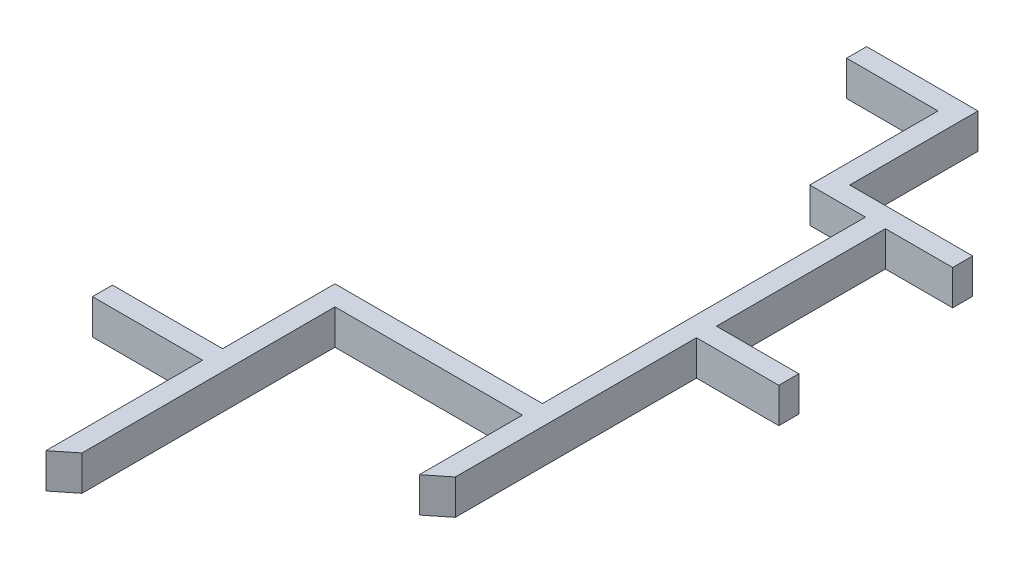
ISO-10303-21;
HEADER;
FILE_DESCRIPTION(('STEP AP214'),'2;1');
FILE_NAME('part.step','',(''),(''),'','','');
FILE_SCHEMA(('AUTOMOTIVE_DESIGN { 1 0 10303 214 1 1 1 1 }'));
ENDSEC;
DATA;
#1=APPLICATION_CONTEXT('core data for automotive mechanical design processes');
#2=APPLICATION_PROTOCOL_DEFINITION('international standard','automotive_design',2000,#1);
#3=PRODUCT_CONTEXT('',#1,'mechanical');
#4=PRODUCT('Part','Part','',(#3));
#5=PRODUCT_RELATED_PRODUCT_CATEGORY('part','',(#4));
#6=PRODUCT_DEFINITION_FORMATION('','',#4);
#7=PRODUCT_DEFINITION_CONTEXT('part definition',#1,'design');
#8=PRODUCT_DEFINITION('design','',#6,#7);
#9=PRODUCT_DEFINITION_SHAPE('','',#8);
#10=(LENGTH_UNIT() NAMED_UNIT(*) SI_UNIT(.MILLI.,.METRE.));
#11=(NAMED_UNIT(*) PLANE_ANGLE_UNIT() SI_UNIT($,.RADIAN.));
#12=(NAMED_UNIT(*) SI_UNIT($,.STERADIAN.) SOLID_ANGLE_UNIT());
#13=UNCERTAINTY_MEASURE_WITH_UNIT(LENGTH_MEASURE(1.E-05),#10,'distance_accuracy_value','');
#14=(GEOMETRIC_REPRESENTATION_CONTEXT(3) GLOBAL_UNCERTAINTY_ASSIGNED_CONTEXT((#13)) GLOBAL_UNIT_ASSIGNED_CONTEXT((#10,
#11,#12)) REPRESENTATION_CONTEXT('',''));
#15=CARTESIAN_POINT('',(0.,0.,0.));
#16=DIRECTION('',(0.,0.,1.));
#17=DIRECTION('',(1.,0.,0.));
#18=AXIS2_PLACEMENT_3D('',#15,#16,#17);
#19=CARTESIAN_POINT('',(40.0618679744798,-0.01,46.4845918549604));
#20=DIRECTION('',(0.624426731607843,0.,0.781083386619858));
#21=DIRECTION('',(0.781083386619858,0.,-0.624426731607843));
#22=AXIS2_PLACEMENT_3D('',#19,#20,#21);
#23=PLANE('',#22);
#24=DIRECTION('',(0.781083386619858,0.,-0.624426731607843));
#25=VECTOR('',#24,1.);
#26=CARTESIAN_POINT('',(38.2923721847623,0.,47.8991917446709));
#27=LINE('',#26,#25);
#28=CARTESIAN_POINT('',(47.3251652677286,0.,40.6780453745054));
#29=VERTEX_POINT('',#28);
#30=CARTESIAN_POINT('',(51.3251652677286,0.,37.48029854079));
#31=VERTEX_POINT('',#30);
#32=EDGE_CURVE('E349',#29,#31,#27,.T.);
#33=ORIENTED_EDGE('',*,*,#32,.T.);
#34=DIRECTION('',(0.,1.,0.));
#35=VECTOR('',#34,1.);
#36=CARTESIAN_POINT('',(51.3251652677286,7.,37.48029854079));
#37=LINE('',#36,#35);
#38=CARTESIAN_POINT('',(51.3251652677286,7.,37.48029854079));
#39=VERTEX_POINT('',#38);
#40=EDGE_CURVE('E346',#31,#39,#37,.T.);
#41=ORIENTED_EDGE('',*,*,#40,.T.);
#42=DIRECTION('',(0.781083386619858,0.,-0.624426731607843));
#43=VECTOR('',#42,1.);
#44=CARTESIAN_POINT('',(38.2923721847623,7.,47.8991917446709));
#45=LINE('',#44,#43);
#46=CARTESIAN_POINT('',(47.3251652677286,7.,40.6780453745054));
#47=VERTEX_POINT('',#46);
#48=EDGE_CURVE('E338',#47,#39,#45,.T.);
#49=ORIENTED_EDGE('',*,*,#48,.F.);
#50=DIRECTION('',(0.,1.,0.));
#51=VECTOR('',#50,1.);
#52=CARTESIAN_POINT('',(47.3251652677286,7.,40.6780453745054));
#53=LINE('',#52,#51);
#54=EDGE_CURVE('E216',#29,#47,#53,.T.);
#55=ORIENTED_EDGE('',*,*,#54,.F.);
#56=EDGE_LOOP('',(#33,#41,#49,#55));
#57=FACE_BOUND('',#56,.T.);
#58=ADVANCED_FACE('F42',(#57),#23,.T.);
#59=CARTESIAN_POINT('',(88.8387773673658,7.,7.49053996257907));
#60=VERTEX_POINT('',#59);
#61=CARTESIAN_POINT('',(92.8387773673658,7.,4.29279312886364));
#62=VERTEX_POINT('',#61);
#63=EDGE_CURVE('E335',#60,#62,#45,.T.);
#64=ORIENTED_EDGE('',*,*,#63,.F.);
#65=DIRECTION('',(0.,-1.,0.));
#66=VECTOR('',#65,1.);
#67=CARTESIAN_POINT('',(88.8387773673658,7.,7.49053996257909));
#68=LINE('',#67,#66);
#69=CARTESIAN_POINT('',(88.8387773673658,0.,7.49053996257907));
#70=VERTEX_POINT('',#69);
#71=EDGE_CURVE('E343',#60,#70,#68,.T.);
#72=ORIENTED_EDGE('',*,*,#71,.T.);
#73=CARTESIAN_POINT('',(92.8387773673658,0.,4.29279312886364));
#74=VERTEX_POINT('',#73);
#75=EDGE_CURVE('E350',#70,#74,#27,.T.);
#76=ORIENTED_EDGE('',*,*,#75,.T.);
#77=DIRECTION('',(0.,-1.,0.));
#78=VECTOR('',#77,1.);
#79=CARTESIAN_POINT('',(92.8387773673658,7.,4.29279312886366));
#80=LINE('',#79,#78);
#81=EDGE_CURVE('E340',#62,#74,#80,.T.);
#82=ORIENTED_EDGE('',*,*,#81,.F.);
#83=EDGE_LOOP('',(#64,#72,#76,#82));
#84=FACE_BOUND('',#83,.T.);
#85=ADVANCED_FACE('F377',(#84),#23,.T.);
#86=CARTESIAN_POINT('',(88.8387773673658,7.,0.));
#87=DIRECTION('',(1.,0.,0.));
#88=DIRECTION('',(0.,0.,-1.));
#89=AXIS2_PLACEMENT_3D('',#86,#87,#88);
#90=PLANE('',#89);
#91=ORIENTED_EDGE('',*,*,#71,.F.);
#92=DIRECTION('',(0.,0.,1.));
#93=VECTOR('',#92,1.);
#94=CARTESIAN_POINT('',(88.8387773673658,7.,0.));
#95=LINE('',#94,#93);
#96=CARTESIAN_POINT('',(88.8387773673658,7.,-13.1378549992244));
#97=VERTEX_POINT('',#96);
#98=EDGE_CURVE('E219',#97,#60,#95,.T.);
#99=ORIENTED_EDGE('',*,*,#98,.F.);
#100=DIRECTION('',(0.,-1.,0.));
#101=VECTOR('',#100,1.);
#102=CARTESIAN_POINT('',(88.8387773673658,7.,-13.1378549992244));
#103=LINE('',#102,#101);
#104=CARTESIAN_POINT('',(88.8387773673658,0.,-13.1378549992244));
#105=VERTEX_POINT('',#104);
#106=EDGE_CURVE('E52',#97,#105,#103,.T.);
#107=ORIENTED_EDGE('',*,*,#106,.T.);
#108=DIRECTION('',(0.,0.,1.));
#109=VECTOR('',#108,1.);
#110=CARTESIAN_POINT('',(88.8387773673658,0.,0.));
#111=LINE('',#110,#109);
#112=EDGE_CURVE('E356',#105,#70,#111,.T.);
#113=ORIENTED_EDGE('',*,*,#112,.T.);
#114=EDGE_LOOP('',(#91,#99,#107,#113));
#115=FACE_BOUND('',#114,.T.);
#116=ADVANCED_FACE('F371',(#115),#90,.F.);
#117=CARTESIAN_POINT('',(51.3251652677286,7.,0.));
#118=DIRECTION('',(-1.,0.,0.));
#119=DIRECTION('',(0.,0.,1.));
#120=AXIS2_PLACEMENT_3D('',#117,#118,#119);
#121=PLANE('',#120);
#122=ORIENTED_EDGE('',*,*,#40,.F.);
#123=DIRECTION('',(0.,0.,-1.));
#124=VECTOR('',#123,1.);
#125=CARTESIAN_POINT('',(51.3251652677286,0.,0.));
#126=LINE('',#125,#124);
#127=CARTESIAN_POINT('',(51.3251652677286,0.,-13.1378549992244));
#128=VERTEX_POINT('',#127);
#129=EDGE_CURVE('E133',#31,#128,#126,.T.);
#130=ORIENTED_EDGE('',*,*,#129,.T.);
#131=DIRECTION('',(0.,-1.,0.));
#132=VECTOR('',#131,1.);
#133=CARTESIAN_POINT('',(51.3251652677286,7.,-13.1378549992244));
#134=LINE('',#133,#132);
#135=CARTESIAN_POINT('',(51.3251652677286,7.,-13.1378549992244));
#136=VERTEX_POINT('',#135);
#137=EDGE_CURVE('E11',#136,#128,#134,.T.);
#138=ORIENTED_EDGE('',*,*,#137,.F.);
#139=DIRECTION('',(0.,0.,-1.));
#140=VECTOR('',#139,1.);
#141=CARTESIAN_POINT('',(51.3251652677286,7.,0.));
#142=LINE('',#141,#140);
#143=EDGE_CURVE('E46',#39,#136,#142,.T.);
#144=ORIENTED_EDGE('',*,*,#143,.F.);
#145=EDGE_LOOP('',(#122,#130,#138,#144));
#146=FACE_BOUND('',#145,.T.);
#147=ADVANCED_FACE('F366',(#146),#121,.F.);
#148=CARTESIAN_POINT('',(92.8387773673658,7.,0.));
#149=DIRECTION('',(1.,0.,0.));
#150=DIRECTION('',(0.,0.,-1.));
#151=AXIS2_PLACEMENT_3D('',#148,#149,#150);
#152=PLANE('',#151);
#153=DIRECTION('',(0.,0.,1.));
#154=VECTOR('',#153,1.);
#155=CARTESIAN_POINT('',(92.8387773673658,7.,0.));
#156=LINE('',#155,#154);
#157=CARTESIAN_POINT('',(92.8387773673658,7.,-43.9556550222508));
#158=VERTEX_POINT('',#157);
#159=EDGE_CURVE('E297',#158,#62,#156,.T.);
#160=ORIENTED_EDGE('',*,*,#159,.T.);
#161=ORIENTED_EDGE('',*,*,#81,.T.);
#162=DIRECTION('',(0.,0.,1.));
#163=VECTOR('',#162,1.);
#164=CARTESIAN_POINT('',(92.8387773673658,0.,0.));
#165=LINE('',#164,#163);
#166=CARTESIAN_POINT('',(92.8387773673658,0.,-43.9556550222508));
#167=VERTEX_POINT('',#166);
#168=EDGE_CURVE('E243',#167,#74,#165,.T.);
#169=ORIENTED_EDGE('',*,*,#168,.F.);
#170=DIRECTION('',(0.,-1.,0.));
#171=VECTOR('',#170,1.);
#172=CARTESIAN_POINT('',(92.8387773673658,7.,-43.9556550222508));
#173=LINE('',#172,#171);
#174=EDGE_CURVE('E146',#158,#167,#173,.T.);
#175=ORIENTED_EDGE('',*,*,#174,.F.);
#176=EDGE_LOOP('',(#160,#161,#169,#175));
#177=FACE_BOUND('',#176,.T.);
#178=ADVANCED_FACE('F388',(#177),#152,.T.);
#179=CARTESIAN_POINT('',(47.3251652677286,7.,0.));
#180=DIRECTION('',(-1.,0.,0.));
#181=DIRECTION('',(0.,0.,1.));
#182=AXIS2_PLACEMENT_3D('',#179,#180,#181);
#183=PLANE('',#182);
#184=DIRECTION('',(0.,0.,-1.));
#185=VECTOR('',#184,1.);
#186=CARTESIAN_POINT('',(47.3251652677286,0.,0.));
#187=LINE('',#186,#185);
#188=CARTESIAN_POINT('',(47.3251652677286,0.,9.34670661054455));
#189=VERTEX_POINT('',#188);
#190=EDGE_CURVE('E295',#29,#189,#187,.T.);
#191=ORIENTED_EDGE('',*,*,#190,.F.);
#192=ORIENTED_EDGE('',*,*,#54,.T.);
#193=DIRECTION('',(0.,0.,-1.));
#194=VECTOR('',#193,1.);
#195=CARTESIAN_POINT('',(47.3251652677286,7.,0.));
#196=LINE('',#195,#194);
#197=CARTESIAN_POINT('',(47.3251652677286,7.,9.34670661054455));
#198=VERTEX_POINT('',#197);
#199=EDGE_CURVE('E208',#47,#198,#196,.T.);
#200=ORIENTED_EDGE('',*,*,#199,.T.);
#201=DIRECTION('',(0.,-1.,0.));
#202=VECTOR('',#201,1.);
#203=CARTESIAN_POINT('',(47.3251652677286,7.,9.34670661054455));
#204=LINE('',#203,#202);
#205=EDGE_CURVE('E212',#198,#189,#204,.T.);
#206=ORIENTED_EDGE('',*,*,#205,.T.);
#207=EDGE_LOOP('',(#191,#192,#200,#206));
#208=FACE_BOUND('',#207,.T.);
#209=ADVANCED_FACE('F211',(#208),#183,.T.);
#210=CARTESIAN_POINT('',(0.,7.,0.));
#211=DIRECTION('',(0.,1.,0.));
#212=DIRECTION('',(0.,0.,1.));
#213=AXIS2_PLACEMENT_3D('',#210,#211,#212);
#214=PLANE('',#213);
#215=ORIENTED_EDGE('',*,*,#199,.F.);
#216=ORIENTED_EDGE('',*,*,#48,.T.);
#217=ORIENTED_EDGE('',*,*,#143,.T.);
#218=DIRECTION('',(1.,0.,0.));
#219=VECTOR('',#218,1.);
#220=CARTESIAN_POINT('',(0.,7.,-13.1378549992244));
#221=LINE('',#220,#219);
#222=EDGE_CURVE('E61',#136,#97,#221,.T.);
#223=ORIENTED_EDGE('',*,*,#222,.T.);
#224=ORIENTED_EDGE('',*,*,#98,.T.);
#225=ORIENTED_EDGE('',*,*,#63,.T.);
#226=ORIENTED_EDGE('',*,*,#159,.F.);
#227=DIRECTION('',(-1.,0.,0.));
#228=VECTOR('',#227,1.);
#229=CARTESIAN_POINT('',(0.,7.,-43.9556550222508));
#230=LINE('',#229,#228);
#231=CARTESIAN_POINT('',(109.315566570714,7.,-43.9556550222508));
#232=VERTEX_POINT('',#231);
#233=EDGE_CURVE('E360',#232,#158,#230,.T.);
#234=ORIENTED_EDGE('',*,*,#233,.F.);
#235=DIRECTION('',(0.,0.,1.));
#236=VECTOR('',#235,1.);
#237=CARTESIAN_POINT('',(109.315566570714,7.,0.));
#238=LINE('',#237,#236);
#239=CARTESIAN_POINT('',(109.315566570714,7.,-47.9556550222508));
#240=VERTEX_POINT('',#239);
#241=EDGE_CURVE('E662',#240,#232,#238,.T.);
#242=ORIENTED_EDGE('',*,*,#241,.F.);
#243=DIRECTION('',(1.,0.,0.));
#244=VECTOR('',#243,1.);
#245=CARTESIAN_POINT('',(0.,7.,-47.9556550222508));
#246=LINE('',#245,#244);
#247=CARTESIAN_POINT('',(92.8387773673658,7.,-47.9556550222508));
#248=VERTEX_POINT('',#247);
#249=EDGE_CURVE('E658',#248,#240,#246,.T.);
#250=ORIENTED_EDGE('',*,*,#249,.F.);
#251=DIRECTION('',(0.,0.,1.));
#252=VECTOR('',#251,1.);
#253=CARTESIAN_POINT('',(92.8387773673658,7.,0.));
#254=LINE('',#253,#252);
#255=CARTESIAN_POINT('',(92.8387773673658,7.,-81.757722567784));
#256=VERTEX_POINT('',#255);
#257=EDGE_CURVE('E661',#256,#248,#254,.T.);
#258=ORIENTED_EDGE('',*,*,#257,.F.);
#259=DIRECTION('',(-1.,0.,0.));
#260=VECTOR('',#259,1.);
#261=CARTESIAN_POINT('',(0.,7.,-81.757722567784));
#262=LINE('',#261,#260);
#263=CARTESIAN_POINT('',(106.296684755089,7.,-81.757722567784));
#264=VERTEX_POINT('',#263);
#265=EDGE_CURVE('E664',#264,#256,#262,.T.);
#266=ORIENTED_EDGE('',*,*,#265,.F.);
#267=DIRECTION('',(0.,0.,1.));
#268=VECTOR('',#267,1.);
#269=CARTESIAN_POINT('',(106.296684755089,7.,0.));
#270=LINE('',#269,#268);
#271=CARTESIAN_POINT('',(106.296684755089,7.,-85.757722567784));
#272=VERTEX_POINT('',#271);
#273=EDGE_CURVE('E671',#272,#264,#270,.T.);
#274=ORIENTED_EDGE('',*,*,#273,.F.);
#275=DIRECTION('',(1.,0.,0.));
#276=VECTOR('',#275,1.);
#277=CARTESIAN_POINT('',(0.,7.,-85.757722567784));
#278=LINE('',#277,#276);
#279=CARTESIAN_POINT('',(81.7030168661557,7.,-85.757722567784));
#280=VERTEX_POINT('',#279);
#281=EDGE_CURVE('E674',#280,#272,#278,.T.);
#282=ORIENTED_EDGE('',*,*,#281,.F.);
#283=DIRECTION('',(0.,0.,1.));
#284=VECTOR('',#283,1.);
#285=CARTESIAN_POINT('',(81.7030168661557,7.,0.));
#286=LINE('',#285,#284);
#287=CARTESIAN_POINT('',(81.7030168661557,7.,-111.420730160044));
#288=VERTEX_POINT('',#287);
#289=EDGE_CURVE('E677',#288,#280,#286,.T.);
#290=ORIENTED_EDGE('',*,*,#289,.F.);
#291=DIRECTION('',(1.,0.,0.));
#292=VECTOR('',#291,1.);
#293=CARTESIAN_POINT('',(0.,7.,-111.420730160044));
#294=LINE('',#293,#292);
#295=CARTESIAN_POINT('',(59.418748665861,7.,-111.420730160044));
#296=VERTEX_POINT('',#295);
#297=EDGE_CURVE('E680',#296,#288,#294,.T.);
#298=ORIENTED_EDGE('',*,*,#297,.F.);
#299=DIRECTION('',(0.,0.,-1.));
#300=VECTOR('',#299,1.);
#301=CARTESIAN_POINT('',(59.418748665861,7.,0.));
#302=LINE('',#301,#300);
#303=CARTESIAN_POINT('',(59.418748665861,7.,-107.420730160044));
#304=VERTEX_POINT('',#303);
#305=EDGE_CURVE('E683',#304,#296,#302,.T.);
#306=ORIENTED_EDGE('',*,*,#305,.F.);
#307=DIRECTION('',(-1.,0.,0.));
#308=VECTOR('',#307,1.);
#309=CARTESIAN_POINT('',(0.,7.,-107.420730160044));
#310=LINE('',#309,#308);
#311=CARTESIAN_POINT('',(77.7030168661557,7.,-107.420730160044));
#312=VERTEX_POINT('',#311);
#313=EDGE_CURVE('E686',#312,#304,#310,.T.);
#314=ORIENTED_EDGE('',*,*,#313,.F.);
#315=DIRECTION('',(0.,0.,-1.));
#316=VECTOR('',#315,1.);
#317=CARTESIAN_POINT('',(77.7030168661557,7.,0.));
#318=LINE('',#317,#316);
#319=CARTESIAN_POINT('',(77.7030168661557,7.,-81.757722567784));
#320=VERTEX_POINT('',#319);
#321=EDGE_CURVE('E689',#320,#312,#318,.T.);
#322=ORIENTED_EDGE('',*,*,#321,.F.);
#323=DIRECTION('',(-1.,0.,0.));
#324=VECTOR('',#323,1.);
#325=CARTESIAN_POINT('',(0.,7.,-81.757722567784));
#326=LINE('',#325,#324);
#327=CARTESIAN_POINT('',(88.8387773673658,7.,-81.757722567784));
#328=VERTEX_POINT('',#327);
#329=EDGE_CURVE('E692',#328,#320,#326,.T.);
#330=ORIENTED_EDGE('',*,*,#329,.F.);
#331=DIRECTION('',(0.,0.,-1.));
#332=VECTOR('',#331,1.);
#333=CARTESIAN_POINT('',(88.8387773673658,7.,0.));
#334=LINE('',#333,#332);
#335=CARTESIAN_POINT('',(88.8387773673658,7.,-17.1378549992244));
#336=VERTEX_POINT('',#335);
#337=EDGE_CURVE('E695',#336,#328,#334,.T.);
#338=ORIENTED_EDGE('',*,*,#337,.F.);
#339=DIRECTION('',(1.,0.,0.));
#340=VECTOR('',#339,1.);
#341=CARTESIAN_POINT('',(0.,7.,-17.1378549992244));
#342=LINE('',#341,#340);
#343=CARTESIAN_POINT('',(47.3251652677286,7.,-17.1378549992244));
#344=VERTEX_POINT('',#343);
#345=EDGE_CURVE('E698',#344,#336,#342,.T.);
#346=ORIENTED_EDGE('',*,*,#345,.F.);
#347=DIRECTION('',(0.,0.,-1.));
#348=VECTOR('',#347,1.);
#349=CARTESIAN_POINT('',(47.3251652677286,7.,0.));
#350=LINE('',#349,#348);
#351=CARTESIAN_POINT('',(47.3251652677286,7.,5.34670661054455));
#352=VERTEX_POINT('',#351);
#353=EDGE_CURVE('E701',#352,#344,#350,.T.);
#354=ORIENTED_EDGE('',*,*,#353,.F.);
#355=DIRECTION('',(1.,0.,0.));
#356=VECTOR('',#355,1.);
#357=CARTESIAN_POINT('',(0.,7.,5.34670661054455));
#358=LINE('',#357,#356);
#359=CARTESIAN_POINT('',(25.2860218086807,7.,5.34670661054455));
#360=VERTEX_POINT('',#359);
#361=EDGE_CURVE('E234',#360,#352,#358,.T.);
#362=ORIENTED_EDGE('',*,*,#361,.F.);
#363=DIRECTION('',(0.,0.,-1.));
#364=VECTOR('',#363,1.);
#365=CARTESIAN_POINT('',(25.2860218086807,7.,0.));
#366=LINE('',#365,#364);
#367=CARTESIAN_POINT('',(25.2860218086807,7.,9.34670661054455));
#368=VERTEX_POINT('',#367);
#369=EDGE_CURVE('E232',#368,#360,#366,.T.);
#370=ORIENTED_EDGE('',*,*,#369,.F.);
#371=DIRECTION('',(-1.,0.,0.));
#372=VECTOR('',#371,1.);
#373=CARTESIAN_POINT('',(0.,7.,9.34670661054456));
#374=LINE('',#373,#372);
#375=EDGE_CURVE('E220',#198,#368,#374,.T.);
#376=ORIENTED_EDGE('',*,*,#375,.F.);
#377=EDGE_LOOP('',(#215,#216,#217,#223,#224,#225,#226,#234,#242,#250,#258,#266,#274,#282,#290,
#298,#306,#314,#322,#330,#338,#346,#354,#362,#370,#376));
#378=FACE_BOUND('',#377,.T.);
#379=ADVANCED_FACE('F44',(#378),#214,.T.);
#380=CARTESIAN_POINT('',(0.,0.,0.));
#381=DIRECTION('',(0.,1.,0.));
#382=DIRECTION('',(0.,0.,1.));
#383=AXIS2_PLACEMENT_3D('',#380,#381,#382);
#384=PLANE('',#383);
#385=ORIENTED_EDGE('',*,*,#32,.F.);
#386=ORIENTED_EDGE('',*,*,#190,.T.);
#387=DIRECTION('',(-1.,0.,0.));
#388=VECTOR('',#387,1.);
#389=CARTESIAN_POINT('',(0.,0.,9.34670661054456));
#390=LINE('',#389,#388);
#391=CARTESIAN_POINT('',(25.2860218086807,0.,9.34670661054455));
#392=VERTEX_POINT('',#391);
#393=EDGE_CURVE('E226',#189,#392,#390,.T.);
#394=ORIENTED_EDGE('',*,*,#393,.T.);
#395=DIRECTION('',(0.,0.,-1.));
#396=VECTOR('',#395,1.);
#397=CARTESIAN_POINT('',(25.2860218086807,0.,0.));
#398=LINE('',#397,#396);
#399=CARTESIAN_POINT('',(25.2860218086807,0.,5.34670661054455));
#400=VERTEX_POINT('',#399);
#401=EDGE_CURVE('E291',#392,#400,#398,.T.);
#402=ORIENTED_EDGE('',*,*,#401,.T.);
#403=DIRECTION('',(1.,0.,0.));
#404=VECTOR('',#403,1.);
#405=CARTESIAN_POINT('',(0.,0.,5.34670661054455));
#406=LINE('',#405,#404);
#407=CARTESIAN_POINT('',(47.3251652677286,0.,5.34670661054455));
#408=VERTEX_POINT('',#407);
#409=EDGE_CURVE('E288',#400,#408,#406,.T.);
#410=ORIENTED_EDGE('',*,*,#409,.T.);
#411=DIRECTION('',(0.,0.,-1.));
#412=VECTOR('',#411,1.);
#413=CARTESIAN_POINT('',(47.3251652677286,0.,0.));
#414=LINE('',#413,#412);
#415=CARTESIAN_POINT('',(47.3251652677286,0.,-17.1378549992244));
#416=VERTEX_POINT('',#415);
#417=EDGE_CURVE('E285',#408,#416,#414,.T.);
#418=ORIENTED_EDGE('',*,*,#417,.T.);
#419=DIRECTION('',(1.,0.,0.));
#420=VECTOR('',#419,1.);
#421=CARTESIAN_POINT('',(0.,0.,-17.1378549992244));
#422=LINE('',#421,#420);
#423=CARTESIAN_POINT('',(88.8387773673658,0.,-17.1378549992244));
#424=VERTEX_POINT('',#423);
#425=EDGE_CURVE('E282',#416,#424,#422,.T.);
#426=ORIENTED_EDGE('',*,*,#425,.T.);
#427=DIRECTION('',(0.,0.,-1.));
#428=VECTOR('',#427,1.);
#429=CARTESIAN_POINT('',(88.8387773673658,0.,0.));
#430=LINE('',#429,#428);
#431=CARTESIAN_POINT('',(88.8387773673658,0.,-81.757722567784));
#432=VERTEX_POINT('',#431);
#433=EDGE_CURVE('E279',#424,#432,#430,.T.);
#434=ORIENTED_EDGE('',*,*,#433,.T.);
#435=DIRECTION('',(-1.,0.,0.));
#436=VECTOR('',#435,1.);
#437=CARTESIAN_POINT('',(0.,0.,-81.757722567784));
#438=LINE('',#437,#436);
#439=CARTESIAN_POINT('',(77.7030168661557,0.,-81.757722567784));
#440=VERTEX_POINT('',#439);
#441=EDGE_CURVE('E276',#432,#440,#438,.T.);
#442=ORIENTED_EDGE('',*,*,#441,.T.);
#443=DIRECTION('',(0.,0.,-1.));
#444=VECTOR('',#443,1.);
#445=CARTESIAN_POINT('',(77.7030168661557,0.,0.));
#446=LINE('',#445,#444);
#447=CARTESIAN_POINT('',(77.7030168661557,0.,-107.420730160044));
#448=VERTEX_POINT('',#447);
#449=EDGE_CURVE('E273',#440,#448,#446,.T.);
#450=ORIENTED_EDGE('',*,*,#449,.T.);
#451=DIRECTION('',(-1.,0.,0.));
#452=VECTOR('',#451,1.);
#453=CARTESIAN_POINT('',(0.,0.,-107.420730160044));
#454=LINE('',#453,#452);
#455=CARTESIAN_POINT('',(59.418748665861,0.,-107.420730160044));
#456=VERTEX_POINT('',#455);
#457=EDGE_CURVE('E270',#448,#456,#454,.T.);
#458=ORIENTED_EDGE('',*,*,#457,.T.);
#459=DIRECTION('',(0.,0.,-1.));
#460=VECTOR('',#459,1.);
#461=CARTESIAN_POINT('',(59.418748665861,0.,0.));
#462=LINE('',#461,#460);
#463=CARTESIAN_POINT('',(59.418748665861,0.,-111.420730160044));
#464=VERTEX_POINT('',#463);
#465=EDGE_CURVE('E267',#456,#464,#462,.T.);
#466=ORIENTED_EDGE('',*,*,#465,.T.);
#467=DIRECTION('',(1.,0.,0.));
#468=VECTOR('',#467,1.);
#469=CARTESIAN_POINT('',(0.,0.,-111.420730160044));
#470=LINE('',#469,#468);
#471=CARTESIAN_POINT('',(81.7030168661557,0.,-111.420730160044));
#472=VERTEX_POINT('',#471);
#473=EDGE_CURVE('E264',#464,#472,#470,.T.);
#474=ORIENTED_EDGE('',*,*,#473,.T.);
#475=DIRECTION('',(0.,0.,1.));
#476=VECTOR('',#475,1.);
#477=CARTESIAN_POINT('',(81.7030168661557,0.,0.));
#478=LINE('',#477,#476);
#479=CARTESIAN_POINT('',(81.7030168661557,0.,-85.757722567784));
#480=VERTEX_POINT('',#479);
#481=EDGE_CURVE('E261',#472,#480,#478,.T.);
#482=ORIENTED_EDGE('',*,*,#481,.T.);
#483=DIRECTION('',(1.,0.,0.));
#484=VECTOR('',#483,1.);
#485=CARTESIAN_POINT('',(0.,0.,-85.757722567784));
#486=LINE('',#485,#484);
#487=CARTESIAN_POINT('',(106.296684755089,0.,-85.757722567784));
#488=VERTEX_POINT('',#487);
#489=EDGE_CURVE('E258',#480,#488,#486,.T.);
#490=ORIENTED_EDGE('',*,*,#489,.T.);
#491=DIRECTION('',(0.,0.,1.));
#492=VECTOR('',#491,1.);
#493=CARTESIAN_POINT('',(106.296684755089,0.,0.));
#494=LINE('',#493,#492);
#495=CARTESIAN_POINT('',(106.296684755089,0.,-81.757722567784));
#496=VERTEX_POINT('',#495);
#497=EDGE_CURVE('E255',#488,#496,#494,.T.);
#498=ORIENTED_EDGE('',*,*,#497,.T.);
#499=DIRECTION('',(-1.,0.,0.));
#500=VECTOR('',#499,1.);
#501=CARTESIAN_POINT('',(0.,0.,-81.757722567784));
#502=LINE('',#501,#500);
#503=CARTESIAN_POINT('',(92.8387773673658,0.,-81.757722567784));
#504=VERTEX_POINT('',#503);
#505=EDGE_CURVE('E252',#496,#504,#502,.T.);
#506=ORIENTED_EDGE('',*,*,#505,.T.);
#507=DIRECTION('',(0.,0.,1.));
#508=VECTOR('',#507,1.);
#509=CARTESIAN_POINT('',(92.8387773673658,0.,0.));
#510=LINE('',#509,#508);
#511=CARTESIAN_POINT('',(92.8387773673658,0.,-47.9556550222508));
#512=VERTEX_POINT('',#511);
#513=EDGE_CURVE('E249',#504,#512,#510,.T.);
#514=ORIENTED_EDGE('',*,*,#513,.T.);
#515=DIRECTION('',(1.,0.,0.));
#516=VECTOR('',#515,1.);
#517=CARTESIAN_POINT('',(0.,0.,-47.9556550222508));
#518=LINE('',#517,#516);
#519=CARTESIAN_POINT('',(109.315566570714,0.,-47.9556550222508));
#520=VERTEX_POINT('',#519);
#521=EDGE_CURVE('E246',#512,#520,#518,.T.);
#522=ORIENTED_EDGE('',*,*,#521,.T.);
#523=DIRECTION('',(0.,0.,1.));
#524=VECTOR('',#523,1.);
#525=CARTESIAN_POINT('',(109.315566570714,0.,0.));
#526=LINE('',#525,#524);
#527=CARTESIAN_POINT('',(109.315566570714,0.,-43.9556550222508));
#528=VERTEX_POINT('',#527);
#529=EDGE_CURVE('E242',#520,#528,#526,.T.);
#530=ORIENTED_EDGE('',*,*,#529,.T.);
#531=DIRECTION('',(-1.,0.,0.));
#532=VECTOR('',#531,1.);
#533=CARTESIAN_POINT('',(0.,0.,-43.9556550222508));
#534=LINE('',#533,#532);
#535=EDGE_CURVE('E239',#528,#167,#534,.T.);
#536=ORIENTED_EDGE('',*,*,#535,.T.);
#537=ORIENTED_EDGE('',*,*,#168,.T.);
#538=ORIENTED_EDGE('',*,*,#75,.F.);
#539=ORIENTED_EDGE('',*,*,#112,.F.);
#540=DIRECTION('',(1.,0.,0.));
#541=VECTOR('',#540,1.);
#542=CARTESIAN_POINT('',(0.,0.,-13.1378549992244));
#543=LINE('',#542,#541);
#544=EDGE_CURVE('E138',#128,#105,#543,.T.);
#545=ORIENTED_EDGE('',*,*,#544,.F.);
#546=ORIENTED_EDGE('',*,*,#129,.F.);
#547=EDGE_LOOP('',(#385,#386,#394,#402,#410,#418,#426,#434,#442,#450,#458,#466,#474,#482,#490,
#498,#506,#514,#522,#530,#536,#537,#538,#539,#545,#546));
#548=FACE_BOUND('',#547,.T.);
#549=ADVANCED_FACE('F384',(#548),#384,.F.);
#550=CARTESIAN_POINT('',(0.,7.,-43.9556550222508));
#551=DIRECTION('',(0.,0.,1.));
#552=DIRECTION('',(1.,0.,0.));
#553=AXIS2_PLACEMENT_3D('',#550,#551,#552);
#554=PLANE('',#553);
#555=ORIENTED_EDGE('',*,*,#535,.F.);
#556=DIRECTION('',(0.,-1.,0.));
#557=VECTOR('',#556,1.);
#558=CARTESIAN_POINT('',(109.315566570714,7.,-43.9556550222508));
#559=LINE('',#558,#557);
#560=EDGE_CURVE('E332',#232,#528,#559,.T.);
#561=ORIENTED_EDGE('',*,*,#560,.F.);
#562=ORIENTED_EDGE('',*,*,#233,.T.);
#563=ORIENTED_EDGE('',*,*,#174,.T.);
#564=EDGE_LOOP('',(#555,#561,#562,#563));
#565=FACE_BOUND('',#564,.T.);
#566=ADVANCED_FACE('F410',(#565),#554,.T.);
#567=CARTESIAN_POINT('',(109.315566570714,7.,0.));
#568=DIRECTION('',(1.,0.,0.));
#569=DIRECTION('',(0.,0.,-1.));
#570=AXIS2_PLACEMENT_3D('',#567,#568,#569);
#571=PLANE('',#570);
#572=ORIENTED_EDGE('',*,*,#529,.F.);
#573=DIRECTION('',(0.,-1.,0.));
#574=VECTOR('',#573,1.);
#575=CARTESIAN_POINT('',(109.315566570714,7.,-47.9556550222508));
#576=LINE('',#575,#574);
#577=EDGE_CURVE('E330',#240,#520,#576,.T.);
#578=ORIENTED_EDGE('',*,*,#577,.F.);
#579=ORIENTED_EDGE('',*,*,#241,.T.);
#580=ORIENTED_EDGE('',*,*,#560,.T.);
#581=EDGE_LOOP('',(#572,#578,#579,#580));
#582=FACE_BOUND('',#581,.T.);
#583=ADVANCED_FACE('F415',(#582),#571,.T.);
#584=CARTESIAN_POINT('',(0.,7.,-47.9556550222508));
#585=DIRECTION('',(0.,0.,-1.));
#586=DIRECTION('',(-1.,0.,0.));
#587=AXIS2_PLACEMENT_3D('',#584,#585,#586);
#588=PLANE('',#587);
#589=ORIENTED_EDGE('',*,*,#521,.F.);
#590=DIRECTION('',(0.,-1.,0.));
#591=VECTOR('',#590,1.);
#592=CARTESIAN_POINT('',(92.8387773673658,7.,-47.9556550222508));
#593=LINE('',#592,#591);
#594=EDGE_CURVE('E328',#248,#512,#593,.T.);
#595=ORIENTED_EDGE('',*,*,#594,.F.);
#596=ORIENTED_EDGE('',*,*,#249,.T.);
#597=ORIENTED_EDGE('',*,*,#577,.T.);
#598=EDGE_LOOP('',(#589,#595,#596,#597));
#599=FACE_BOUND('',#598,.T.);
#600=ADVANCED_FACE('F599',(#599),#588,.T.);
#601=CARTESIAN_POINT('',(92.8387773673658,7.,0.));
#602=DIRECTION('',(1.,0.,0.));
#603=DIRECTION('',(0.,0.,-1.));
#604=AXIS2_PLACEMENT_3D('',#601,#602,#603);
#605=PLANE('',#604);
#606=ORIENTED_EDGE('',*,*,#513,.F.);
#607=DIRECTION('',(0.,-1.,0.));
#608=VECTOR('',#607,1.);
#609=CARTESIAN_POINT('',(92.8387773673658,7.,-81.757722567784));
#610=LINE('',#609,#608);
#611=EDGE_CURVE('E326',#256,#504,#610,.T.);
#612=ORIENTED_EDGE('',*,*,#611,.F.);
#613=ORIENTED_EDGE('',*,*,#257,.T.);
#614=ORIENTED_EDGE('',*,*,#594,.T.);
#615=EDGE_LOOP('',(#606,#612,#613,#614));
#616=FACE_BOUND('',#615,.T.);
#617=ADVANCED_FACE('F590',(#616),#605,.T.);
#618=CARTESIAN_POINT('',(0.,7.,-81.757722567784));
#619=DIRECTION('',(0.,0.,1.));
#620=DIRECTION('',(1.,0.,0.));
#621=AXIS2_PLACEMENT_3D('',#618,#619,#620);
#622=PLANE('',#621);
#623=ORIENTED_EDGE('',*,*,#505,.F.);
#624=DIRECTION('',(0.,-1.,0.));
#625=VECTOR('',#624,1.);
#626=CARTESIAN_POINT('',(106.296684755089,7.,-81.757722567784));
#627=LINE('',#626,#625);
#628=EDGE_CURVE('E324',#264,#496,#627,.T.);
#629=ORIENTED_EDGE('',*,*,#628,.F.);
#630=ORIENTED_EDGE('',*,*,#265,.T.);
#631=ORIENTED_EDGE('',*,*,#611,.T.);
#632=EDGE_LOOP('',(#623,#629,#630,#631));
#633=FACE_BOUND('',#632,.T.);
#634=ADVANCED_FACE('F581',(#633),#622,.T.);
#635=CARTESIAN_POINT('',(106.296684755089,7.,0.));
#636=DIRECTION('',(1.,0.,0.));
#637=DIRECTION('',(0.,0.,-1.));
#638=AXIS2_PLACEMENT_3D('',#635,#636,#637);
#639=PLANE('',#638);
#640=ORIENTED_EDGE('',*,*,#497,.F.);
#641=DIRECTION('',(0.,-1.,0.));
#642=VECTOR('',#641,1.);
#643=CARTESIAN_POINT('',(106.296684755089,7.,-85.757722567784));
#644=LINE('',#643,#642);
#645=EDGE_CURVE('E322',#272,#488,#644,.T.);
#646=ORIENTED_EDGE('',*,*,#645,.F.);
#647=ORIENTED_EDGE('',*,*,#273,.T.);
#648=ORIENTED_EDGE('',*,*,#628,.T.);
#649=EDGE_LOOP('',(#640,#646,#647,#648));
#650=FACE_BOUND('',#649,.T.);
#651=ADVANCED_FACE('F572',(#650),#639,.T.);
#652=CARTESIAN_POINT('',(0.,7.,-85.757722567784));
#653=DIRECTION('',(0.,0.,-1.));
#654=DIRECTION('',(-1.,0.,0.));
#655=AXIS2_PLACEMENT_3D('',#652,#653,#654);
#656=PLANE('',#655);
#657=ORIENTED_EDGE('',*,*,#489,.F.);
#658=DIRECTION('',(0.,-1.,0.));
#659=VECTOR('',#658,1.);
#660=CARTESIAN_POINT('',(81.7030168661557,7.,-85.757722567784));
#661=LINE('',#660,#659);
#662=EDGE_CURVE('E320',#280,#480,#661,.T.);
#663=ORIENTED_EDGE('',*,*,#662,.F.);
#664=ORIENTED_EDGE('',*,*,#281,.T.);
#665=ORIENTED_EDGE('',*,*,#645,.T.);
#666=EDGE_LOOP('',(#657,#663,#664,#665));
#667=FACE_BOUND('',#666,.T.);
#668=ADVANCED_FACE('F563',(#667),#656,.T.);
#669=CARTESIAN_POINT('',(81.7030168661557,7.,0.));
#670=DIRECTION('',(1.,0.,0.));
#671=DIRECTION('',(0.,0.,-1.));
#672=AXIS2_PLACEMENT_3D('',#669,#670,#671);
#673=PLANE('',#672);
#674=ORIENTED_EDGE('',*,*,#481,.F.);
#675=DIRECTION('',(0.,-1.,0.));
#676=VECTOR('',#675,1.);
#677=CARTESIAN_POINT('',(81.7030168661557,7.,-111.420730160044));
#678=LINE('',#677,#676);
#679=EDGE_CURVE('E318',#288,#472,#678,.T.);
#680=ORIENTED_EDGE('',*,*,#679,.F.);
#681=ORIENTED_EDGE('',*,*,#289,.T.);
#682=ORIENTED_EDGE('',*,*,#662,.T.);
#683=EDGE_LOOP('',(#674,#680,#681,#682));
#684=FACE_BOUND('',#683,.T.);
#685=ADVANCED_FACE('F554',(#684),#673,.T.);
#686=CARTESIAN_POINT('',(0.,7.,-111.420730160044));
#687=DIRECTION('',(0.,0.,-1.));
#688=DIRECTION('',(-1.,0.,0.));
#689=AXIS2_PLACEMENT_3D('',#686,#687,#688);
#690=PLANE('',#689);
#691=ORIENTED_EDGE('',*,*,#473,.F.);
#692=DIRECTION('',(0.,-1.,0.));
#693=VECTOR('',#692,1.);
#694=CARTESIAN_POINT('',(59.418748665861,7.,-111.420730160044));
#695=LINE('',#694,#693);
#696=EDGE_CURVE('E316',#296,#464,#695,.T.);
#697=ORIENTED_EDGE('',*,*,#696,.F.);
#698=ORIENTED_EDGE('',*,*,#297,.T.);
#699=ORIENTED_EDGE('',*,*,#679,.T.);
#700=EDGE_LOOP('',(#691,#697,#698,#699));
#701=FACE_BOUND('',#700,.T.);
#702=ADVANCED_FACE('F545',(#701),#690,.T.);
#703=CARTESIAN_POINT('',(59.418748665861,7.,0.));
#704=DIRECTION('',(-1.,0.,0.));
#705=DIRECTION('',(0.,0.,1.));
#706=AXIS2_PLACEMENT_3D('',#703,#704,#705);
#707=PLANE('',#706);
#708=ORIENTED_EDGE('',*,*,#465,.F.);
#709=DIRECTION('',(0.,-1.,0.));
#710=VECTOR('',#709,1.);
#711=CARTESIAN_POINT('',(59.418748665861,7.,-107.420730160044));
#712=LINE('',#711,#710);
#713=EDGE_CURVE('E314',#304,#456,#712,.T.);
#714=ORIENTED_EDGE('',*,*,#713,.F.);
#715=ORIENTED_EDGE('',*,*,#305,.T.);
#716=ORIENTED_EDGE('',*,*,#696,.T.);
#717=EDGE_LOOP('',(#708,#714,#715,#716));
#718=FACE_BOUND('',#717,.T.);
#719=ADVANCED_FACE('F536',(#718),#707,.T.);
#720=CARTESIAN_POINT('',(0.,7.,-107.420730160044));
#721=DIRECTION('',(0.,0.,1.));
#722=DIRECTION('',(1.,0.,0.));
#723=AXIS2_PLACEMENT_3D('',#720,#721,#722);
#724=PLANE('',#723);
#725=ORIENTED_EDGE('',*,*,#457,.F.);
#726=DIRECTION('',(0.,-1.,0.));
#727=VECTOR('',#726,1.);
#728=CARTESIAN_POINT('',(77.7030168661557,7.,-107.420730160044));
#729=LINE('',#728,#727);
#730=EDGE_CURVE('E312',#312,#448,#729,.T.);
#731=ORIENTED_EDGE('',*,*,#730,.F.);
#732=ORIENTED_EDGE('',*,*,#313,.T.);
#733=ORIENTED_EDGE('',*,*,#713,.T.);
#734=EDGE_LOOP('',(#725,#731,#732,#733));
#735=FACE_BOUND('',#734,.T.);
#736=ADVANCED_FACE('F527',(#735),#724,.T.);
#737=CARTESIAN_POINT('',(77.7030168661557,7.,0.));
#738=DIRECTION('',(-1.,0.,0.));
#739=DIRECTION('',(0.,0.,1.));
#740=AXIS2_PLACEMENT_3D('',#737,#738,#739);
#741=PLANE('',#740);
#742=ORIENTED_EDGE('',*,*,#449,.F.);
#743=DIRECTION('',(0.,-1.,0.));
#744=VECTOR('',#743,1.);
#745=CARTESIAN_POINT('',(77.7030168661557,7.,-81.757722567784));
#746=LINE('',#745,#744);
#747=EDGE_CURVE('E310',#320,#440,#746,.T.);
#748=ORIENTED_EDGE('',*,*,#747,.F.);
#749=ORIENTED_EDGE('',*,*,#321,.T.);
#750=ORIENTED_EDGE('',*,*,#730,.T.);
#751=EDGE_LOOP('',(#742,#748,#749,#750));
#752=FACE_BOUND('',#751,.T.);
#753=ADVANCED_FACE('F518',(#752),#741,.T.);
#754=CARTESIAN_POINT('',(0.,7.,-81.757722567784));
#755=DIRECTION('',(0.,0.,1.));
#756=DIRECTION('',(1.,0.,0.));
#757=AXIS2_PLACEMENT_3D('',#754,#755,#756);
#758=PLANE('',#757);
#759=ORIENTED_EDGE('',*,*,#441,.F.);
#760=DIRECTION('',(0.,-1.,0.));
#761=VECTOR('',#760,1.);
#762=CARTESIAN_POINT('',(88.8387773673658,7.,-81.757722567784));
#763=LINE('',#762,#761);
#764=EDGE_CURVE('E308',#328,#432,#763,.T.);
#765=ORIENTED_EDGE('',*,*,#764,.F.);
#766=ORIENTED_EDGE('',*,*,#329,.T.);
#767=ORIENTED_EDGE('',*,*,#747,.T.);
#768=EDGE_LOOP('',(#759,#765,#766,#767));
#769=FACE_BOUND('',#768,.T.);
#770=ADVANCED_FACE('F509',(#769),#758,.T.);
#771=CARTESIAN_POINT('',(88.8387773673658,7.,0.));
#772=DIRECTION('',(-1.,0.,0.));
#773=DIRECTION('',(0.,0.,1.));
#774=AXIS2_PLACEMENT_3D('',#771,#772,#773);
#775=PLANE('',#774);
#776=ORIENTED_EDGE('',*,*,#433,.F.);
#777=DIRECTION('',(0.,-1.,0.));
#778=VECTOR('',#777,1.);
#779=CARTESIAN_POINT('',(88.8387773673658,7.,-17.1378549992244));
#780=LINE('',#779,#778);
#781=EDGE_CURVE('E306',#336,#424,#780,.T.);
#782=ORIENTED_EDGE('',*,*,#781,.F.);
#783=ORIENTED_EDGE('',*,*,#337,.T.);
#784=ORIENTED_EDGE('',*,*,#764,.T.);
#785=EDGE_LOOP('',(#776,#782,#783,#784));
#786=FACE_BOUND('',#785,.T.);
#787=ADVANCED_FACE('F500',(#786),#775,.T.);
#788=CARTESIAN_POINT('',(0.,7.,-17.1378549992244));
#789=DIRECTION('',(0.,0.,-1.));
#790=DIRECTION('',(-1.,0.,0.));
#791=AXIS2_PLACEMENT_3D('',#788,#789,#790);
#792=PLANE('',#791);
#793=ORIENTED_EDGE('',*,*,#425,.F.);
#794=DIRECTION('',(0.,-1.,0.));
#795=VECTOR('',#794,1.);
#796=CARTESIAN_POINT('',(47.3251652677286,7.,-17.1378549992244));
#797=LINE('',#796,#795);
#798=EDGE_CURVE('E304',#344,#416,#797,.T.);
#799=ORIENTED_EDGE('',*,*,#798,.F.);
#800=ORIENTED_EDGE('',*,*,#345,.T.);
#801=ORIENTED_EDGE('',*,*,#781,.T.);
#802=EDGE_LOOP('',(#793,#799,#800,#801));
#803=FACE_BOUND('',#802,.T.);
#804=ADVANCED_FACE('F491',(#803),#792,.T.);
#805=CARTESIAN_POINT('',(47.3251652677286,7.,0.));
#806=DIRECTION('',(-1.,0.,0.));
#807=DIRECTION('',(0.,0.,1.));
#808=AXIS2_PLACEMENT_3D('',#805,#806,#807);
#809=PLANE('',#808);
#810=ORIENTED_EDGE('',*,*,#417,.F.);
#811=DIRECTION('',(0.,-1.,0.));
#812=VECTOR('',#811,1.);
#813=CARTESIAN_POINT('',(47.3251652677286,7.,5.34670661054455));
#814=LINE('',#813,#812);
#815=EDGE_CURVE('E302',#352,#408,#814,.T.);
#816=ORIENTED_EDGE('',*,*,#815,.F.);
#817=ORIENTED_EDGE('',*,*,#353,.T.);
#818=ORIENTED_EDGE('',*,*,#798,.T.);
#819=EDGE_LOOP('',(#810,#816,#817,#818));
#820=FACE_BOUND('',#819,.T.);
#821=ADVANCED_FACE('F482',(#820),#809,.T.);
#822=CARTESIAN_POINT('',(0.,7.,5.34670661054455));
#823=DIRECTION('',(0.,0.,-1.));
#824=DIRECTION('',(-1.,0.,0.));
#825=AXIS2_PLACEMENT_3D('',#822,#823,#824);
#826=PLANE('',#825);
#827=ORIENTED_EDGE('',*,*,#409,.F.);
#828=DIRECTION('',(0.,-1.,0.));
#829=VECTOR('',#828,1.);
#830=CARTESIAN_POINT('',(25.2860218086807,7.,5.34670661054455));
#831=LINE('',#830,#829);
#832=EDGE_CURVE('E300',#360,#400,#831,.T.);
#833=ORIENTED_EDGE('',*,*,#832,.F.);
#834=ORIENTED_EDGE('',*,*,#361,.T.);
#835=ORIENTED_EDGE('',*,*,#815,.T.);
#836=EDGE_LOOP('',(#827,#833,#834,#835));
#837=FACE_BOUND('',#836,.T.);
#838=ADVANCED_FACE('F473',(#837),#826,.T.);
#839=CARTESIAN_POINT('',(25.2860218086807,7.,0.));
#840=DIRECTION('',(-1.,0.,0.));
#841=DIRECTION('',(0.,0.,1.));
#842=AXIS2_PLACEMENT_3D('',#839,#840,#841);
#843=PLANE('',#842);
#844=ORIENTED_EDGE('',*,*,#401,.F.);
#845=DIRECTION('',(0.,-1.,0.));
#846=VECTOR('',#845,1.);
#847=CARTESIAN_POINT('',(25.2860218086807,7.,9.34670661054455));
#848=LINE('',#847,#846);
#849=EDGE_CURVE('E227',#368,#392,#848,.T.);
#850=ORIENTED_EDGE('',*,*,#849,.F.);
#851=ORIENTED_EDGE('',*,*,#369,.T.);
#852=ORIENTED_EDGE('',*,*,#832,.T.);
#853=EDGE_LOOP('',(#844,#850,#851,#852));
#854=FACE_BOUND('',#853,.T.);
#855=ADVANCED_FACE('F465',(#854),#843,.T.);
#856=CARTESIAN_POINT('',(0.,7.,9.34670661054456));
#857=DIRECTION('',(0.,0.,1.));
#858=DIRECTION('',(1.,0.,0.));
#859=AXIS2_PLACEMENT_3D('',#856,#857,#858);
#860=PLANE('',#859);
#861=ORIENTED_EDGE('',*,*,#393,.F.);
#862=ORIENTED_EDGE('',*,*,#205,.F.);
#863=ORIENTED_EDGE('',*,*,#375,.T.);
#864=ORIENTED_EDGE('',*,*,#849,.T.);
#865=EDGE_LOOP('',(#861,#862,#863,#864));
#866=FACE_BOUND('',#865,.T.);
#867=ADVANCED_FACE('F224',(#866),#860,.T.);
#868=CARTESIAN_POINT('',(0.,7.,-13.1378549992244));
#869=DIRECTION('',(0.,0.,-1.));
#870=DIRECTION('',(-1.,0.,0.));
#871=AXIS2_PLACEMENT_3D('',#868,#869,#870);
#872=PLANE('',#871);
#873=ORIENTED_EDGE('',*,*,#544,.T.);
#874=ORIENTED_EDGE('',*,*,#106,.F.);
#875=ORIENTED_EDGE('',*,*,#222,.F.);
#876=ORIENTED_EDGE('',*,*,#137,.T.);
#877=EDGE_LOOP('',(#873,#874,#875,#876));
#878=FACE_BOUND('',#877,.T.);
#879=ADVANCED_FACE('F367',(#878),#872,.F.);
#880=CLOSED_SHELL('',(#58,#85,#116,#147,#178,#209,#379,#549,#566,#583,#600,#617,#634,#651,#668,
#685,#702,#719,#736,#753,#770,#787,#804,#821,#838,#855,#867,#879));
#881=MANIFOLD_SOLID_BREP('B2',#880);
#882=ADVANCED_BREP_SHAPE_REPRESENTATION('',(#18,#881),#14);
#883=SHAPE_DEFINITION_REPRESENTATION(#9,#882);
ENDSEC;
END-ISO-10303-21;
